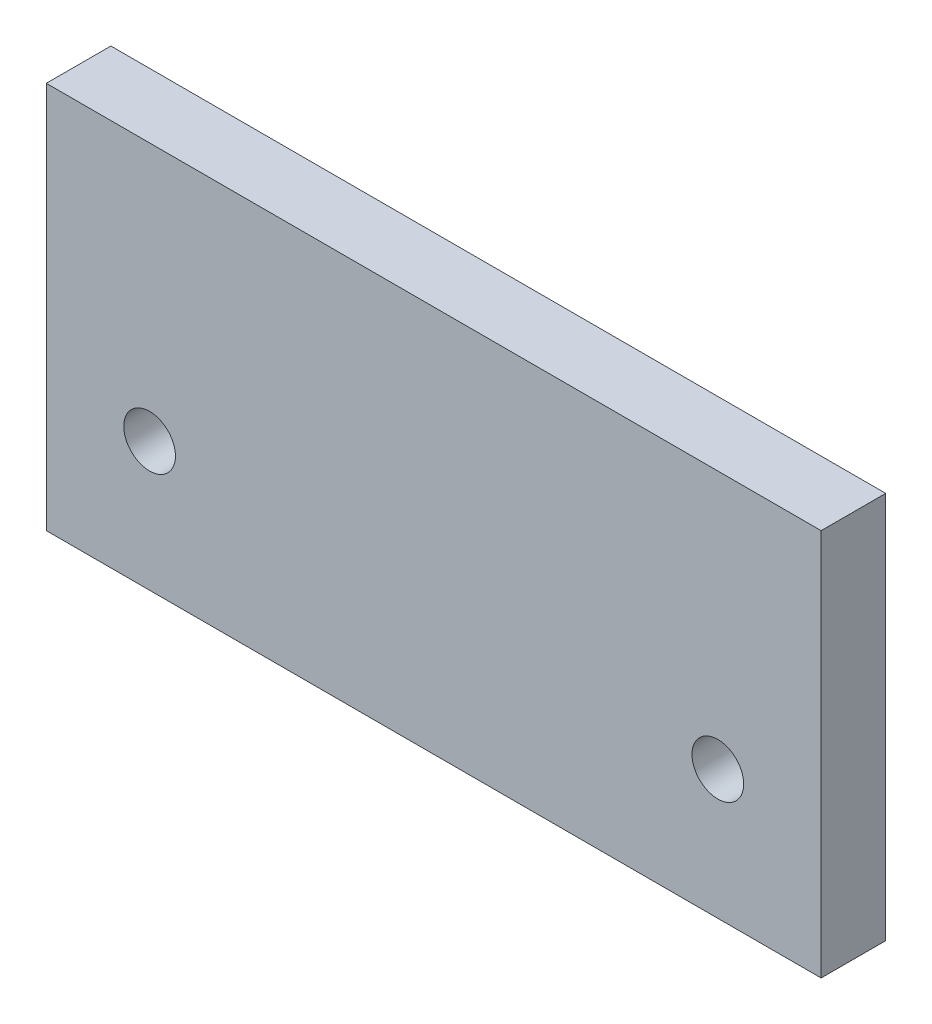
ISO-10303-21;
HEADER;
FILE_DESCRIPTION(('STEP AP214'),'2;1');
FILE_NAME('part.step','',(''),(''),'','','');
FILE_SCHEMA(('AUTOMOTIVE_DESIGN { 1 0 10303 214 1 1 1 1 }'));
ENDSEC;
DATA;
#1=APPLICATION_CONTEXT('core data for automotive mechanical design processes');
#2=APPLICATION_PROTOCOL_DEFINITION('international standard','automotive_design',2000,#1);
#3=PRODUCT_CONTEXT('',#1,'mechanical');
#4=PRODUCT('Part','Part','',(#3));
#5=PRODUCT_RELATED_PRODUCT_CATEGORY('part','',(#4));
#6=PRODUCT_DEFINITION_FORMATION('','',#4);
#7=PRODUCT_DEFINITION_CONTEXT('part definition',#1,'design');
#8=PRODUCT_DEFINITION('design','',#6,#7);
#9=PRODUCT_DEFINITION_SHAPE('','',#8);
#10=(LENGTH_UNIT() NAMED_UNIT(*) SI_UNIT(.MILLI.,.METRE.));
#11=(NAMED_UNIT(*) PLANE_ANGLE_UNIT() SI_UNIT($,.RADIAN.));
#12=(NAMED_UNIT(*) SI_UNIT($,.STERADIAN.) SOLID_ANGLE_UNIT());
#13=UNCERTAINTY_MEASURE_WITH_UNIT(LENGTH_MEASURE(1.E-05),#10,'distance_accuracy_value','');
#14=(GEOMETRIC_REPRESENTATION_CONTEXT(3) GLOBAL_UNCERTAINTY_ASSIGNED_CONTEXT((#13)) GLOBAL_UNIT_ASSIGNED_CONTEXT((#10,
#11,#12)) REPRESENTATION_CONTEXT('',''));
#15=CARTESIAN_POINT('',(0.,0.,0.));
#16=DIRECTION('',(0.,0.,1.));
#17=DIRECTION('',(1.,0.,0.));
#18=AXIS2_PLACEMENT_3D('',#15,#16,#17);
#19=CARTESIAN_POINT('',(0.,0.,5.));
#20=DIRECTION('',(0.,0.,1.));
#21=DIRECTION('',(1.,0.,0.));
#22=AXIS2_PLACEMENT_3D('',#19,#20,#21);
#23=PLANE('',#22);
#24=CARTESIAN_POINT('',(-39.5538067854572,-11.4306444571604,5.));
#25=DIRECTION('',(0.,0.,1.));
#26=DIRECTION('',(1.,0.,0.));
#27=AXIS2_PLACEMENT_3D('',#24,#25,#26);
#28=CIRCLE('',#27,2.);
#29=CARTESIAN_POINT('',(-37.5538067854572,-11.4306444571604,5.));
#30=VERTEX_POINT('',#29);
#31=EDGE_CURVE('E100',#30,#30,#28,.T.);
#32=ORIENTED_EDGE('',*,*,#31,.F.);
#33=EDGE_LOOP('',(#32));
#34=FACE_BOUND('',#33,.T.);
#35=DIRECTION('',(0.,-1.,0.));
#36=VECTOR('',#35,1.);
#37=CARTESIAN_POINT('',(-47.5538067854572,8.56935554283963,5.));
#38=LINE('',#37,#36);
#39=CARTESIAN_POINT('',(-47.5538067854572,8.56935554283963,5.));
#40=VERTEX_POINT('',#39);
#41=CARTESIAN_POINT('',(-47.5538067854572,-21.4306444571604,5.));
#42=VERTEX_POINT('',#41);
#43=EDGE_CURVE('E85',#40,#42,#38,.T.);
#44=ORIENTED_EDGE('',*,*,#43,.T.);
#45=DIRECTION('',(1.,0.,0.));
#46=VECTOR('',#45,1.);
#47=CARTESIAN_POINT('',(-47.5538067854572,-21.4306444571604,5.));
#48=LINE('',#47,#46);
#49=CARTESIAN_POINT('',(12.4461932145428,-21.4306444571604,5.));
#50=VERTEX_POINT('',#49);
#51=EDGE_CURVE('E80',#42,#50,#48,.T.);
#52=ORIENTED_EDGE('',*,*,#51,.T.);
#53=DIRECTION('',(0.,1.,0.));
#54=VECTOR('',#53,1.);
#55=CARTESIAN_POINT('',(12.4461932145428,8.56935554283963,5.));
#56=LINE('',#55,#54);
#57=CARTESIAN_POINT('',(12.4461932145428,8.56935554283963,5.));
#58=VERTEX_POINT('',#57);
#59=EDGE_CURVE('E83',#50,#58,#56,.T.);
#60=ORIENTED_EDGE('',*,*,#59,.T.);
#61=DIRECTION('',(-1.,0.,0.));
#62=VECTOR('',#61,1.);
#63=CARTESIAN_POINT('',(-47.5538067854572,8.56935554283963,5.));
#64=LINE('',#63,#62);
#65=EDGE_CURVE('E50',#58,#40,#64,.T.);
#66=ORIENTED_EDGE('',*,*,#65,.T.);
#67=EDGE_LOOP('',(#44,#52,#60,#66));
#68=FACE_BOUND('',#67,.T.);
#69=CARTESIAN_POINT('',(4.44619321454282,-11.4306444571604,5.));
#70=DIRECTION('',(0.,0.,1.));
#71=DIRECTION('',(-1.,0.,0.));
#72=AXIS2_PLACEMENT_3D('',#69,#70,#71);
#73=CIRCLE('',#72,2.);
#74=CARTESIAN_POINT('',(2.44619321454282,-11.4306444571604,5.));
#75=VERTEX_POINT('',#74);
#76=EDGE_CURVE('E115',#75,#75,#73,.T.);
#77=ORIENTED_EDGE('',*,*,#76,.F.);
#78=EDGE_LOOP('',(#77));
#79=FACE_BOUND('',#78,.T.);
#80=ADVANCED_FACE('F33',(#34,#68,#79),#23,.T.);
#81=CARTESIAN_POINT('',(0.,0.,0.));
#82=DIRECTION('',(0.,0.,1.));
#83=DIRECTION('',(1.,0.,0.));
#84=AXIS2_PLACEMENT_3D('',#81,#82,#83);
#85=PLANE('',#84);
#86=DIRECTION('',(0.,-1.,0.));
#87=VECTOR('',#86,1.);
#88=CARTESIAN_POINT('',(-47.5538067854572,8.56935554283963,0.));
#89=LINE('',#88,#87);
#90=CARTESIAN_POINT('',(-47.5538067854572,8.56935554283963,0.));
#91=VERTEX_POINT('',#90);
#92=CARTESIAN_POINT('',(-47.5538067854572,-21.4306444571604,0.));
#93=VERTEX_POINT('',#92);
#94=EDGE_CURVE('E97',#91,#93,#89,.T.);
#95=ORIENTED_EDGE('',*,*,#94,.F.);
#96=DIRECTION('',(-1.,0.,0.));
#97=VECTOR('',#96,1.);
#98=CARTESIAN_POINT('',(-47.5538067854572,8.56935554283963,0.));
#99=LINE('',#98,#97);
#100=CARTESIAN_POINT('',(12.4461932145428,8.56935554283963,0.));
#101=VERTEX_POINT('',#100);
#102=EDGE_CURVE('E73',#101,#91,#99,.T.);
#103=ORIENTED_EDGE('',*,*,#102,.F.);
#104=DIRECTION('',(0.,1.,0.));
#105=VECTOR('',#104,1.);
#106=CARTESIAN_POINT('',(12.4461932145428,8.56935554283963,0.));
#107=LINE('',#106,#105);
#108=CARTESIAN_POINT('',(12.4461932145428,-21.4306444571604,0.));
#109=VERTEX_POINT('',#108);
#110=EDGE_CURVE('E67',#109,#101,#107,.T.);
#111=ORIENTED_EDGE('',*,*,#110,.F.);
#112=DIRECTION('',(1.,0.,0.));
#113=VECTOR('',#112,1.);
#114=CARTESIAN_POINT('',(-47.5538067854572,-21.4306444571604,0.));
#115=LINE('',#114,#113);
#116=EDGE_CURVE('E89',#93,#109,#115,.T.);
#117=ORIENTED_EDGE('',*,*,#116,.F.);
#118=EDGE_LOOP('',(#95,#103,#111,#117));
#119=FACE_BOUND('',#118,.T.);
#120=CARTESIAN_POINT('',(-39.5538067854572,-11.4306444571604,0.));
#121=DIRECTION('',(0.,0.,1.));
#122=DIRECTION('',(1.,0.,0.));
#123=AXIS2_PLACEMENT_3D('',#120,#121,#122);
#124=CIRCLE('',#123,2.);
#125=CARTESIAN_POINT('',(-37.5538067854572,-11.4306444571604,0.));
#126=VERTEX_POINT('',#125);
#127=EDGE_CURVE('E112',#126,#126,#124,.T.);
#128=ORIENTED_EDGE('',*,*,#127,.T.);
#129=EDGE_LOOP('',(#128));
#130=FACE_BOUND('',#129,.T.);
#131=CARTESIAN_POINT('',(4.44619321454282,-11.4306444571604,0.));
#132=DIRECTION('',(0.,0.,1.));
#133=DIRECTION('',(-1.,0.,0.));
#134=AXIS2_PLACEMENT_3D('',#131,#132,#133);
#135=CIRCLE('',#134,2.);
#136=CARTESIAN_POINT('',(2.44619321454282,-11.4306444571604,0.));
#137=VERTEX_POINT('',#136);
#138=EDGE_CURVE('E118',#137,#137,#135,.T.);
#139=ORIENTED_EDGE('',*,*,#138,.T.);
#140=EDGE_LOOP('',(#139));
#141=FACE_BOUND('',#140,.T.);
#142=ADVANCED_FACE('F108',(#119,#130,#141),#85,.F.);
#143=CARTESIAN_POINT('',(-47.5538067854572,8.56935554283963,5.));
#144=DIRECTION('',(1.,0.,0.));
#145=DIRECTION('',(0.,1.,0.));
#146=AXIS2_PLACEMENT_3D('',#143,#144,#145);
#147=PLANE('',#146);
#148=ORIENTED_EDGE('',*,*,#94,.T.);
#149=DIRECTION('',(0.,0.,-1.));
#150=VECTOR('',#149,1.);
#151=CARTESIAN_POINT('',(-47.5538067854572,-21.4306444571604,5.));
#152=LINE('',#151,#150);
#153=EDGE_CURVE('E11',#42,#93,#152,.T.);
#154=ORIENTED_EDGE('',*,*,#153,.F.);
#155=ORIENTED_EDGE('',*,*,#43,.F.);
#156=DIRECTION('',(0.,0.,-1.));
#157=VECTOR('',#156,1.);
#158=CARTESIAN_POINT('',(-47.5538067854572,8.56935554283963,5.));
#159=LINE('',#158,#157);
#160=EDGE_CURVE('E93',#40,#91,#159,.T.);
#161=ORIENTED_EDGE('',*,*,#160,.T.);
#162=EDGE_LOOP('',(#148,#154,#155,#161));
#163=FACE_BOUND('',#162,.T.);
#164=ADVANCED_FACE('F35',(#163),#147,.F.);
#165=CARTESIAN_POINT('',(-47.5538067854572,-21.4306444571604,5.));
#166=DIRECTION('',(0.,1.,0.));
#167=DIRECTION('',(0.,0.,1.));
#168=AXIS2_PLACEMENT_3D('',#165,#166,#167);
#169=PLANE('',#168);
#170=ORIENTED_EDGE('',*,*,#116,.T.);
#171=DIRECTION('',(0.,0.,-1.));
#172=VECTOR('',#171,1.);
#173=CARTESIAN_POINT('',(12.4461932145428,-21.4306444571604,5.));
#174=LINE('',#173,#172);
#175=EDGE_CURVE('E42',#50,#109,#174,.T.);
#176=ORIENTED_EDGE('',*,*,#175,.F.);
#177=ORIENTED_EDGE('',*,*,#51,.F.);
#178=ORIENTED_EDGE('',*,*,#153,.T.);
#179=EDGE_LOOP('',(#170,#176,#177,#178));
#180=FACE_BOUND('',#179,.T.);
#181=ADVANCED_FACE('F88',(#180),#169,.F.);
#182=CARTESIAN_POINT('',(12.4461932145428,8.56935554283963,5.));
#183=DIRECTION('',(-1.,0.,0.));
#184=DIRECTION('',(0.,-1.,0.));
#185=AXIS2_PLACEMENT_3D('',#182,#183,#184);
#186=PLANE('',#185);
#187=ORIENTED_EDGE('',*,*,#110,.T.);
#188=DIRECTION('',(0.,0.,-1.));
#189=VECTOR('',#188,1.);
#190=CARTESIAN_POINT('',(12.4461932145428,8.56935554283963,5.));
#191=LINE('',#190,#189);
#192=EDGE_CURVE('E90',#58,#101,#191,.T.);
#193=ORIENTED_EDGE('',*,*,#192,.F.);
#194=ORIENTED_EDGE('',*,*,#59,.F.);
#195=ORIENTED_EDGE('',*,*,#175,.T.);
#196=EDGE_LOOP('',(#187,#193,#194,#195));
#197=FACE_BOUND('',#196,.T.);
#198=ADVANCED_FACE('F91',(#197),#186,.F.);
#199=CARTESIAN_POINT('',(-47.5538067854572,8.56935554283963,5.));
#200=DIRECTION('',(0.,-1.,0.));
#201=DIRECTION('',(0.,0.,-1.));
#202=AXIS2_PLACEMENT_3D('',#199,#200,#201);
#203=PLANE('',#202);
#204=ORIENTED_EDGE('',*,*,#102,.T.);
#205=ORIENTED_EDGE('',*,*,#160,.F.);
#206=ORIENTED_EDGE('',*,*,#65,.F.);
#207=ORIENTED_EDGE('',*,*,#192,.T.);
#208=EDGE_LOOP('',(#204,#205,#206,#207));
#209=FACE_BOUND('',#208,.T.);
#210=ADVANCED_FACE('F105',(#209),#203,.F.);
#211=CARTESIAN_POINT('',(-39.5538067854572,-11.4306444571604,5.));
#212=DIRECTION('',(0.,0.,-1.));
#213=DIRECTION('',(-1.,0.,0.));
#214=AXIS2_PLACEMENT_3D('',#211,#212,#213);
#215=CYLINDRICAL_SURFACE('',#214,2.);
#216=ORIENTED_EDGE('',*,*,#31,.T.);
#217=EDGE_LOOP('',(#216));
#218=FACE_BOUND('',#217,.T.);
#219=ORIENTED_EDGE('',*,*,#127,.F.);
#220=EDGE_LOOP('',(#219));
#221=FACE_BOUND('',#220,.T.);
#222=ADVANCED_FACE('F135',(#218,#221),#215,.F.);
#223=CARTESIAN_POINT('',(4.44619321454282,-11.4306444571604,5.));
#224=DIRECTION('',(0.,0.,-1.));
#225=DIRECTION('',(-1.,0.,0.));
#226=AXIS2_PLACEMENT_3D('',#223,#224,#225);
#227=CYLINDRICAL_SURFACE('',#226,2.);
#228=ORIENTED_EDGE('',*,*,#76,.T.);
#229=EDGE_LOOP('',(#228));
#230=FACE_BOUND('',#229,.T.);
#231=ORIENTED_EDGE('',*,*,#138,.F.);
#232=EDGE_LOOP('',(#231));
#233=FACE_BOUND('',#232,.T.);
#234=ADVANCED_FACE('F124',(#230,#233),#227,.F.);
#235=CLOSED_SHELL('',(#80,#142,#164,#181,#198,#210,#222,#234));
#236=MANIFOLD_SOLID_BREP('B2',#235);
#237=ADVANCED_BREP_SHAPE_REPRESENTATION('',(#18,#236),#14);
#238=SHAPE_DEFINITION_REPRESENTATION(#9,#237);
ENDSEC;
END-ISO-10303-21;
